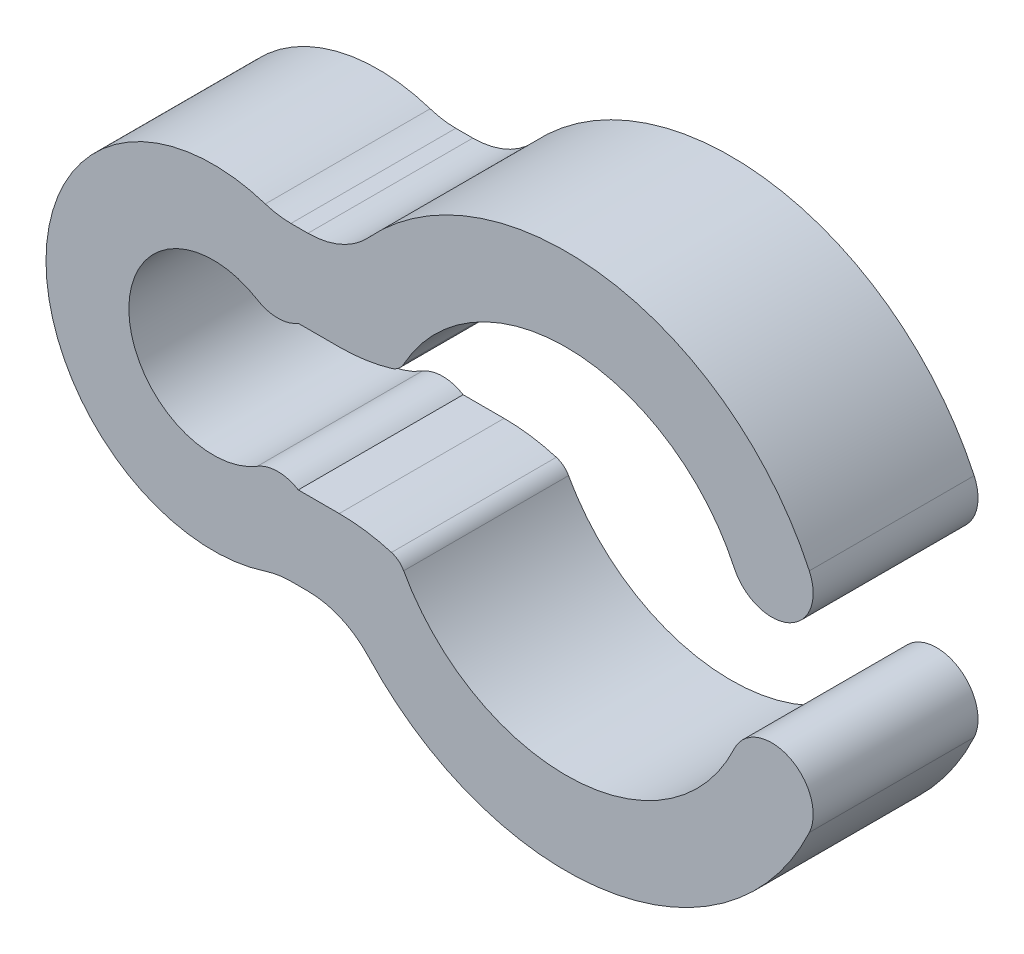
ISO-10303-21;
HEADER;
FILE_DESCRIPTION(('STEP AP214'),'2;1');
FILE_NAME('part.step','',(''),(''),'','','');
FILE_SCHEMA(('AUTOMOTIVE_DESIGN { 1 0 10303 214 1 1 1 1 }'));
ENDSEC;
DATA;
#1=APPLICATION_CONTEXT('core data for automotive mechanical design processes');
#2=APPLICATION_PROTOCOL_DEFINITION('international standard','automotive_design',2000,#1);
#3=PRODUCT_CONTEXT('',#1,'mechanical');
#4=PRODUCT('Part','Part','',(#3));
#5=PRODUCT_RELATED_PRODUCT_CATEGORY('part','',(#4));
#6=PRODUCT_DEFINITION_FORMATION('','',#4);
#7=PRODUCT_DEFINITION_CONTEXT('part definition',#1,'design');
#8=PRODUCT_DEFINITION('design','',#6,#7);
#9=PRODUCT_DEFINITION_SHAPE('','',#8);
#10=(LENGTH_UNIT() NAMED_UNIT(*) SI_UNIT(.MILLI.,.METRE.));
#11=(NAMED_UNIT(*) PLANE_ANGLE_UNIT() SI_UNIT($,.RADIAN.));
#12=(NAMED_UNIT(*) SI_UNIT($,.STERADIAN.) SOLID_ANGLE_UNIT());
#13=UNCERTAINTY_MEASURE_WITH_UNIT(LENGTH_MEASURE(1.E-05),#10,'distance_accuracy_value','');
#14=(GEOMETRIC_REPRESENTATION_CONTEXT(3) GLOBAL_UNCERTAINTY_ASSIGNED_CONTEXT((#13)) GLOBAL_UNIT_ASSIGNED_CONTEXT((#10,
#11,#12)) REPRESENTATION_CONTEXT('',''));
#15=CARTESIAN_POINT('',(0.,0.,0.));
#16=DIRECTION('',(0.,0.,1.));
#17=DIRECTION('',(1.,0.,0.));
#18=AXIS2_PLACEMENT_3D('',#15,#16,#17);
#19=CARTESIAN_POINT('',(-6.26438344931087,5.76,4.));
#20=DIRECTION('',(0.,0.,-1.));
#21=DIRECTION('',(-1.,0.,0.));
#22=AXIS2_PLACEMENT_3D('',#19,#20,#21);
#23=CYLINDRICAL_SURFACE('',#22,2.);
#24=CARTESIAN_POINT('',(-6.26438344931087,5.76,0.));
#25=DIRECTION('',(0.,0.,-1.));
#26=DIRECTION('',(1.,0.,0.));
#27=AXIS2_PLACEMENT_3D('',#24,#25,#26);
#28=CIRCLE('',#27,2.);
#29=CARTESIAN_POINT('',(-4.79214292068317,4.40629847238543,0.));
#30=VERTEX_POINT('',#29);
#31=CARTESIAN_POINT('',(-6.26438344931087,3.76,0.));
#32=VERTEX_POINT('',#31);
#33=EDGE_CURVE('E230',#30,#32,#28,.T.);
#34=ORIENTED_EDGE('',*,*,#33,.T.);
#35=DIRECTION('',(0.,0.,-1.));
#36=VECTOR('',#35,1.);
#37=CARTESIAN_POINT('',(-6.26438344931087,3.76,4.));
#38=LINE('',#37,#36);
#39=CARTESIAN_POINT('',(-6.26438344931087,3.76,4.));
#40=VERTEX_POINT('',#39);
#41=EDGE_CURVE('E11',#40,#32,#38,.T.);
#42=ORIENTED_EDGE('',*,*,#41,.F.);
#43=CARTESIAN_POINT('',(-6.26438344931087,5.76,4.));
#44=DIRECTION('',(0.,0.,-1.));
#45=DIRECTION('',(1.,0.,0.));
#46=AXIS2_PLACEMENT_3D('',#43,#44,#45);
#47=CIRCLE('',#46,2.);
#48=CARTESIAN_POINT('',(-4.79214292068317,4.40629847238543,4.));
#49=VERTEX_POINT('',#48);
#50=EDGE_CURVE('E294',#49,#40,#47,.T.);
#51=ORIENTED_EDGE('',*,*,#50,.F.);
#52=DIRECTION('',(0.,0.,-1.));
#53=VECTOR('',#52,1.);
#54=CARTESIAN_POINT('',(-4.79214292068317,4.40629847238543,4.));
#55=LINE('',#54,#53);
#56=EDGE_CURVE('E226',#49,#30,#55,.T.);
#57=ORIENTED_EDGE('',*,*,#56,.T.);
#58=EDGE_LOOP('',(#34,#42,#51,#57));
#59=FACE_BOUND('',#58,.T.);
#60=ADVANCED_FACE('F45',(#59),#23,.F.);
#61=CARTESIAN_POINT('',(-6.67691742082297,3.76,4.));
#62=DIRECTION('',(0.,-1.,0.));
#63=DIRECTION('',(0.,0.,-1.));
#64=AXIS2_PLACEMENT_3D('',#61,#62,#63);
#65=PLANE('',#64);
#66=DIRECTION('',(-1.,0.,0.));
#67=VECTOR('',#66,1.);
#68=CARTESIAN_POINT('',(-6.67691742082297,3.76,0.));
#69=LINE('',#68,#67);
#70=CARTESIAN_POINT('',(-6.67691742082297,3.76,0.));
#71=VERTEX_POINT('',#70);
#72=EDGE_CURVE('E234',#32,#71,#69,.T.);
#73=ORIENTED_EDGE('',*,*,#72,.T.);
#74=DIRECTION('',(0.,0.,-1.));
#75=VECTOR('',#74,1.);
#76=CARTESIAN_POINT('',(-6.67691742082297,3.76,4.));
#77=LINE('',#76,#75);
#78=CARTESIAN_POINT('',(-6.67691742082297,3.76,4.));
#79=VERTEX_POINT('',#78);
#80=EDGE_CURVE('E54',#79,#71,#77,.T.);
#81=ORIENTED_EDGE('',*,*,#80,.F.);
#82=DIRECTION('',(-1.,0.,0.));
#83=VECTOR('',#82,1.);
#84=CARTESIAN_POINT('',(-6.67691742082297,3.76,4.));
#85=LINE('',#84,#83);
#86=EDGE_CURVE('E147',#40,#79,#85,.T.);
#87=ORIENTED_EDGE('',*,*,#86,.F.);
#88=ORIENTED_EDGE('',*,*,#41,.T.);
#89=EDGE_LOOP('',(#73,#81,#87,#88));
#90=FACE_BOUND('',#89,.T.);
#91=ADVANCED_FACE('F458',(#90),#65,.F.);
#92=CARTESIAN_POINT('',(-6.67691742082297,5.76,4.));
#93=DIRECTION('',(0.,0.,-1.));
#94=DIRECTION('',(-1.,0.,0.));
#95=AXIS2_PLACEMENT_3D('',#92,#93,#94);
#96=CYLINDRICAL_SURFACE('',#95,2.);
#97=CARTESIAN_POINT('',(-6.67691742082297,5.76,0.));
#98=DIRECTION('',(0.,0.,-1.));
#99=DIRECTION('',(-1.,0.,0.));
#100=AXIS2_PLACEMENT_3D('',#97,#98,#99);
#101=CIRCLE('',#100,2.);
#102=CARTESIAN_POINT('',(-7.29839681989129,3.8590099009901,0.));
#103=VERTEX_POINT('',#102);
#104=EDGE_CURVE('E237',#71,#103,#101,.T.);
#105=ORIENTED_EDGE('',*,*,#104,.T.);
#106=DIRECTION('',(0.,0.,-1.));
#107=VECTOR('',#106,1.);
#108=CARTESIAN_POINT('',(-7.29839681989129,3.8590099009901,4.));
#109=LINE('',#108,#107);
#110=CARTESIAN_POINT('',(-7.29839681989129,3.8590099009901,4.));
#111=VERTEX_POINT('',#110);
#112=EDGE_CURVE('E361',#111,#103,#109,.T.);
#113=ORIENTED_EDGE('',*,*,#112,.F.);
#114=CARTESIAN_POINT('',(-6.67691742082297,5.76,4.));
#115=DIRECTION('',(0.,0.,-1.));
#116=DIRECTION('',(-1.,0.,0.));
#117=AXIS2_PLACEMENT_3D('',#114,#115,#116);
#118=CIRCLE('',#117,2.);
#119=EDGE_CURVE('E371',#79,#111,#118,.T.);
#120=ORIENTED_EDGE('',*,*,#119,.F.);
#121=ORIENTED_EDGE('',*,*,#80,.T.);
#122=EDGE_LOOP('',(#105,#113,#120,#121));
#123=FACE_BOUND('',#122,.T.);
#124=ADVANCED_FACE('F369',(#123),#96,.F.);
#125=CARTESIAN_POINT('',(-8.56,0.,4.));
#126=DIRECTION('',(0.,0.,-1.));
#127=DIRECTION('',(-1.,0.,0.));
#128=AXIS2_PLACEMENT_3D('',#125,#126,#127);
#129=CYLINDRICAL_SURFACE('',#128,4.06);
#130=CARTESIAN_POINT('',(-8.56,0.,0.));
#131=DIRECTION('',(0.,0.,1.));
#132=DIRECTION('',(1.,0.,0.));
#133=AXIS2_PLACEMENT_3D('',#130,#131,#132);
#134=CIRCLE('',#133,4.06);
#135=CARTESIAN_POINT('',(-7.2983968198913,-3.8590099009901,0.));
#136=VERTEX_POINT('',#135);
#137=EDGE_CURVE('E240',#103,#136,#134,.T.);
#138=ORIENTED_EDGE('',*,*,#137,.T.);
#139=DIRECTION('',(0.,0.,-1.));
#140=VECTOR('',#139,1.);
#141=CARTESIAN_POINT('',(-7.2983968198913,-3.8590099009901,4.));
#142=LINE('',#141,#140);
#143=CARTESIAN_POINT('',(-7.2983968198913,-3.8590099009901,4.));
#144=VERTEX_POINT('',#143);
#145=EDGE_CURVE('E357',#144,#136,#142,.T.);
#146=ORIENTED_EDGE('',*,*,#145,.F.);
#147=CARTESIAN_POINT('',(-8.56,0.,4.));
#148=DIRECTION('',(0.,0.,1.));
#149=DIRECTION('',(1.,0.,0.));
#150=AXIS2_PLACEMENT_3D('',#147,#148,#149);
#151=CIRCLE('',#150,4.06);
#152=EDGE_CURVE('E390',#111,#144,#151,.T.);
#153=ORIENTED_EDGE('',*,*,#152,.F.);
#154=ORIENTED_EDGE('',*,*,#112,.T.);
#155=EDGE_LOOP('',(#138,#146,#153,#154));
#156=FACE_BOUND('',#155,.T.);
#157=ADVANCED_FACE('F380',(#156),#129,.T.);
#158=CARTESIAN_POINT('',(-6.67691742082297,-5.76,4.));
#159=DIRECTION('',(0.,0.,-1.));
#160=DIRECTION('',(-1.,0.,0.));
#161=AXIS2_PLACEMENT_3D('',#158,#159,#160);
#162=CYLINDRICAL_SURFACE('',#161,2.);
#163=CARTESIAN_POINT('',(-6.67691742082297,-5.76,0.));
#164=DIRECTION('',(0.,0.,-1.));
#165=DIRECTION('',(1.,0.,0.));
#166=AXIS2_PLACEMENT_3D('',#163,#164,#165);
#167=CIRCLE('',#166,2.);
#168=CARTESIAN_POINT('',(-6.67691742082297,-3.76,0.));
#169=VERTEX_POINT('',#168);
#170=EDGE_CURVE('E243',#136,#169,#167,.T.);
#171=ORIENTED_EDGE('',*,*,#170,.T.);
#172=DIRECTION('',(0.,0.,-1.));
#173=VECTOR('',#172,1.);
#174=CARTESIAN_POINT('',(-6.67691742082297,-3.76,4.));
#175=LINE('',#174,#173);
#176=CARTESIAN_POINT('',(-6.67691742082297,-3.76,4.));
#177=VERTEX_POINT('',#176);
#178=EDGE_CURVE('E353',#177,#169,#175,.T.);
#179=ORIENTED_EDGE('',*,*,#178,.F.);
#180=CARTESIAN_POINT('',(-6.67691742082297,-5.76,4.));
#181=DIRECTION('',(0.,0.,-1.));
#182=DIRECTION('',(1.,0.,0.));
#183=AXIS2_PLACEMENT_3D('',#180,#181,#182);
#184=CIRCLE('',#183,2.);
#185=EDGE_CURVE('E386',#144,#177,#184,.T.);
#186=ORIENTED_EDGE('',*,*,#185,.F.);
#187=ORIENTED_EDGE('',*,*,#145,.T.);
#188=EDGE_LOOP('',(#171,#179,#186,#187));
#189=FACE_BOUND('',#188,.T.);
#190=ADVANCED_FACE('F384',(#189),#162,.F.);
#191=CARTESIAN_POINT('',(-6.67691742082297,-3.76,4.));
#192=DIRECTION('',(0.,1.,0.));
#193=DIRECTION('',(-1.,0.,0.));
#194=AXIS2_PLACEMENT_3D('',#191,#192,#193);
#195=PLANE('',#194);
#196=DIRECTION('',(1.,0.,0.));
#197=VECTOR('',#196,1.);
#198=CARTESIAN_POINT('',(-6.67691742082297,-3.76,0.));
#199=LINE('',#198,#197);
#200=CARTESIAN_POINT('',(-6.26438344931088,-3.76,0.));
#201=VERTEX_POINT('',#200);
#202=EDGE_CURVE('E246',#169,#201,#199,.T.);
#203=ORIENTED_EDGE('',*,*,#202,.T.);
#204=DIRECTION('',(0.,0.,-1.));
#205=VECTOR('',#204,1.);
#206=CARTESIAN_POINT('',(-6.26438344931088,-3.76,4.));
#207=LINE('',#206,#205);
#208=CARTESIAN_POINT('',(-6.26438344931088,-3.76,4.));
#209=VERTEX_POINT('',#208);
#210=EDGE_CURVE('E349',#209,#201,#207,.T.);
#211=ORIENTED_EDGE('',*,*,#210,.F.);
#212=DIRECTION('',(1.,0.,0.));
#213=VECTOR('',#212,1.);
#214=CARTESIAN_POINT('',(-6.67691742082297,-3.76,4.));
#215=LINE('',#214,#213);
#216=EDGE_CURVE('E389',#177,#209,#215,.T.);
#217=ORIENTED_EDGE('',*,*,#216,.F.);
#218=ORIENTED_EDGE('',*,*,#178,.T.);
#219=EDGE_LOOP('',(#203,#211,#217,#218));
#220=FACE_BOUND('',#219,.T.);
#221=ADVANCED_FACE('F471',(#220),#195,.F.);
#222=CARTESIAN_POINT('',(-6.26438344931088,-5.76,4.));
#223=DIRECTION('',(0.,0.,-1.));
#224=DIRECTION('',(-1.,0.,0.));
#225=AXIS2_PLACEMENT_3D('',#222,#223,#224);
#226=CYLINDRICAL_SURFACE('',#225,2.);
#227=CARTESIAN_POINT('',(-6.26438344931088,-5.76,0.));
#228=DIRECTION('',(0.,0.,-1.));
#229=DIRECTION('',(-1.,0.,0.));
#230=AXIS2_PLACEMENT_3D('',#227,#228,#229);
#231=CIRCLE('',#230,2.);
#232=CARTESIAN_POINT('',(-4.79214292068318,-4.40629847238543,0.));
#233=VERTEX_POINT('',#232);
#234=EDGE_CURVE('E249',#201,#233,#231,.T.);
#235=ORIENTED_EDGE('',*,*,#234,.T.);
#236=DIRECTION('',(0.,0.,-1.));
#237=VECTOR('',#236,1.);
#238=CARTESIAN_POINT('',(-4.79214292068318,-4.40629847238543,4.));
#239=LINE('',#238,#237);
#240=CARTESIAN_POINT('',(-4.79214292068318,-4.40629847238543,4.));
#241=VERTEX_POINT('',#240);
#242=EDGE_CURVE('E345',#241,#233,#239,.T.);
#243=ORIENTED_EDGE('',*,*,#242,.F.);
#244=CARTESIAN_POINT('',(-6.26438344931088,-5.76,4.));
#245=DIRECTION('',(0.,0.,-1.));
#246=DIRECTION('',(-1.,0.,0.));
#247=AXIS2_PLACEMENT_3D('',#244,#245,#246);
#248=CIRCLE('',#247,2.);
#249=EDGE_CURVE('E394',#209,#241,#248,.T.);
#250=ORIENTED_EDGE('',*,*,#249,.F.);
#251=ORIENTED_EDGE('',*,*,#210,.T.);
#252=EDGE_LOOP('',(#235,#243,#250,#251));
#253=FACE_BOUND('',#252,.T.);
#254=ADVANCED_FACE('F474',(#253),#226,.F.);
#255=CARTESIAN_POINT('',(0.,0.,4.));
#256=DIRECTION('',(0.,0.,-1.));
#257=DIRECTION('',(-1.,0.,0.));
#258=AXIS2_PLACEMENT_3D('',#255,#256,#257);
#259=CYLINDRICAL_SURFACE('',#258,6.51);
#260=CARTESIAN_POINT('',(0.,0.,0.));
#261=DIRECTION('',(0.,0.,1.));
#262=DIRECTION('',(1.,0.,0.));
#263=AXIS2_PLACEMENT_3D('',#260,#261,#262);
#264=CIRCLE('',#263,6.51);
#265=CARTESIAN_POINT('',(5.90126525039805,-2.74866666666667,0.));
#266=VERTEX_POINT('',#265);
#267=EDGE_CURVE('E252',#233,#266,#264,.T.);
#268=ORIENTED_EDGE('',*,*,#267,.T.);
#269=DIRECTION('',(0.,0.,-1.));
#270=VECTOR('',#269,1.);
#271=CARTESIAN_POINT('',(5.90126525039805,-2.74866666666667,4.));
#272=LINE('',#271,#270);
#273=CARTESIAN_POINT('',(5.90126525039805,-2.74866666666667,4.));
#274=VERTEX_POINT('',#273);
#275=EDGE_CURVE('E341',#274,#266,#272,.T.);
#276=ORIENTED_EDGE('',*,*,#275,.F.);
#277=CARTESIAN_POINT('',(0.,0.,4.));
#278=DIRECTION('',(0.,0.,1.));
#279=DIRECTION('',(1.,0.,0.));
#280=AXIS2_PLACEMENT_3D('',#277,#278,#279);
#281=CIRCLE('',#280,6.51);
#282=EDGE_CURVE('E401',#241,#274,#281,.T.);
#283=ORIENTED_EDGE('',*,*,#282,.F.);
#284=ORIENTED_EDGE('',*,*,#242,.T.);
#285=EDGE_LOOP('',(#268,#276,#283,#284));
#286=FACE_BOUND('',#285,.T.);
#287=ADVANCED_FACE('F478',(#286),#259,.T.);
#288=CARTESIAN_POINT('',(4.99024043063614,-2.32433333333333,4.));
#289=DIRECTION('',(0.,0.,-1.));
#290=DIRECTION('',(-1.,0.,0.));
#291=AXIS2_PLACEMENT_3D('',#288,#289,#290);
#292=CYLINDRICAL_SURFACE('',#291,1.005);
#293=CARTESIAN_POINT('',(4.99024043063614,-2.32433333333333,0.));
#294=DIRECTION('',(0.,0.,1.));
#295=DIRECTION('',(1.,0.,0.));
#296=AXIS2_PLACEMENT_3D('',#293,#294,#295);
#297=CIRCLE('',#296,1.005);
#298=CARTESIAN_POINT('',(4.07921561087423,-1.9,0.));
#299=VERTEX_POINT('',#298);
#300=EDGE_CURVE('E255',#266,#299,#297,.T.);
#301=ORIENTED_EDGE('',*,*,#300,.T.);
#302=DIRECTION('',(0.,0.,-1.));
#303=VECTOR('',#302,1.);
#304=CARTESIAN_POINT('',(4.07921561087423,-1.9,4.));
#305=LINE('',#304,#303);
#306=CARTESIAN_POINT('',(4.07921561087423,-1.9,4.));
#307=VERTEX_POINT('',#306);
#308=EDGE_CURVE('E337',#307,#299,#305,.T.);
#309=ORIENTED_EDGE('',*,*,#308,.F.);
#310=CARTESIAN_POINT('',(4.99024043063614,-2.32433333333333,4.));
#311=DIRECTION('',(0.,0.,1.));
#312=DIRECTION('',(1.,0.,0.));
#313=AXIS2_PLACEMENT_3D('',#310,#311,#312);
#314=CIRCLE('',#313,1.005);
#315=EDGE_CURVE('E404',#274,#307,#314,.T.);
#316=ORIENTED_EDGE('',*,*,#315,.F.);
#317=ORIENTED_EDGE('',*,*,#275,.T.);
#318=EDGE_LOOP('',(#301,#309,#316,#317));
#319=FACE_BOUND('',#318,.T.);
#320=ADVANCED_FACE('F482',(#319),#292,.T.);
#321=CARTESIAN_POINT('',(0.,0.,4.));
#322=DIRECTION('',(0.,0.,-1.));
#323=DIRECTION('',(-1.,0.,0.));
#324=AXIS2_PLACEMENT_3D('',#321,#322,#323);
#325=CYLINDRICAL_SURFACE('',#324,4.5);
#326=CARTESIAN_POINT('',(0.,0.,0.));
#327=DIRECTION('',(0.,0.,-1.));
#328=DIRECTION('',(1.,0.,0.));
#329=AXIS2_PLACEMENT_3D('',#326,#327,#328);
#330=CIRCLE('',#329,4.5);
#331=CARTESIAN_POINT('',(-3.94129190088489,-2.17168555551193,0.));
#332=VERTEX_POINT('',#331);
#333=EDGE_CURVE('E258',#299,#332,#330,.T.);
#334=ORIENTED_EDGE('',*,*,#333,.T.);
#335=DIRECTION('',(0.,0.,-1.));
#336=VECTOR('',#335,1.);
#337=CARTESIAN_POINT('',(-3.94129190088489,-2.17168555551193,4.));
#338=LINE('',#337,#336);
#339=CARTESIAN_POINT('',(-3.94129190088489,-2.17168555551193,4.));
#340=VERTEX_POINT('',#339);
#341=EDGE_CURVE('E333',#340,#332,#338,.T.);
#342=ORIENTED_EDGE('',*,*,#341,.F.);
#343=CARTESIAN_POINT('',(0.,0.,4.));
#344=DIRECTION('',(0.,0.,-1.));
#345=DIRECTION('',(1.,0.,0.));
#346=AXIS2_PLACEMENT_3D('',#343,#344,#345);
#347=CIRCLE('',#346,4.5);
#348=EDGE_CURVE('E407',#307,#340,#347,.T.);
#349=ORIENTED_EDGE('',*,*,#348,.F.);
#350=ORIENTED_EDGE('',*,*,#308,.T.);
#351=EDGE_LOOP('',(#334,#342,#349,#350));
#352=FACE_BOUND('',#351,.T.);
#353=ADVANCED_FACE('F486',(#352),#325,.F.);
#354=CARTESIAN_POINT('',(-4.37921322320543,-2.41298395056881,4.));
#355=DIRECTION('',(0.,0.,-1.));
#356=DIRECTION('',(-1.,0.,0.));
#357=AXIS2_PLACEMENT_3D('',#354,#355,#356);
#358=CYLINDRICAL_SURFACE('',#357,0.5);
#359=CARTESIAN_POINT('',(-4.37921322320543,-2.41298395056881,0.));
#360=DIRECTION('',(0.,0.,1.));
#361=DIRECTION('',(1.,0.,0.));
#362=AXIS2_PLACEMENT_3D('',#359,#360,#361);
#363=CIRCLE('',#362,0.5);
#364=CARTESIAN_POINT('',(-4.23741190929705,-1.93351300528239,0.));
#365=VERTEX_POINT('',#364);
#366=EDGE_CURVE('E261',#332,#365,#363,.T.);
#367=ORIENTED_EDGE('',*,*,#366,.T.);
#368=DIRECTION('',(0.,0.,-1.));
#369=VECTOR('',#368,1.);
#370=CARTESIAN_POINT('',(-4.23741190929705,-1.93351300528239,4.));
#371=LINE('',#370,#369);
#372=CARTESIAN_POINT('',(-4.23741190929705,-1.93351300528239,4.));
#373=VERTEX_POINT('',#372);
#374=EDGE_CURVE('E329',#373,#365,#371,.T.);
#375=ORIENTED_EDGE('',*,*,#374,.F.);
#376=CARTESIAN_POINT('',(-4.37921322320543,-2.41298395056881,4.));
#377=DIRECTION('',(0.,0.,1.));
#378=DIRECTION('',(1.,0.,0.));
#379=AXIS2_PLACEMENT_3D('',#376,#377,#378);
#380=CIRCLE('',#379,0.5);
#381=EDGE_CURVE('E410',#340,#373,#380,.T.);
#382=ORIENTED_EDGE('',*,*,#381,.F.);
#383=ORIENTED_EDGE('',*,*,#341,.T.);
#384=EDGE_LOOP('',(#367,#375,#382,#383));
#385=FACE_BOUND('',#384,.T.);
#386=ADVANCED_FACE('F490',(#385),#358,.T.);
#387=CARTESIAN_POINT('',(-5.505,-6.21959219123293,4.));
#388=DIRECTION('',(0.,0.,-1.));
#389=DIRECTION('',(-1.,0.,0.));
#390=AXIS2_PLACEMENT_3D('',#387,#388,#389);
#391=CYLINDRICAL_SURFACE('',#390,4.46959219123293);
#392=CARTESIAN_POINT('',(-5.505,-6.21959219123293,0.));
#393=DIRECTION('',(0.,0.,1.));
#394=DIRECTION('',(-1.,0.,0.));
#395=AXIS2_PLACEMENT_3D('',#392,#393,#394);
#396=CIRCLE('',#395,4.46959219123293);
#397=CARTESIAN_POINT('',(-5.505,-1.75,0.));
#398=VERTEX_POINT('',#397);
#399=EDGE_CURVE('E264',#365,#398,#396,.T.);
#400=ORIENTED_EDGE('',*,*,#399,.T.);
#401=DIRECTION('',(0.,0.,-1.));
#402=VECTOR('',#401,1.);
#403=CARTESIAN_POINT('',(-5.505,-1.75,4.));
#404=LINE('',#403,#402);
#405=CARTESIAN_POINT('',(-5.505,-1.75,4.));
#406=VERTEX_POINT('',#405);
#407=EDGE_CURVE('E325',#406,#398,#404,.T.);
#408=ORIENTED_EDGE('',*,*,#407,.F.);
#409=CARTESIAN_POINT('',(-5.505,-6.21959219123293,4.));
#410=DIRECTION('',(0.,0.,1.));
#411=DIRECTION('',(-1.,0.,0.));
#412=AXIS2_PLACEMENT_3D('',#409,#410,#411);
#413=CIRCLE('',#412,4.46959219123293);
#414=EDGE_CURVE('E413',#373,#406,#413,.T.);
#415=ORIENTED_EDGE('',*,*,#414,.F.);
#416=ORIENTED_EDGE('',*,*,#374,.T.);
#417=EDGE_LOOP('',(#400,#408,#415,#416));
#418=FACE_BOUND('',#417,.T.);
#419=ADVANCED_FACE('F494',(#418),#391,.T.);
#420=CARTESIAN_POINT('',(-6.49864608739844,-1.75,4.));
#421=DIRECTION('',(0.,-1.,0.));
#422=DIRECTION('',(0.,0.,-1.));
#423=AXIS2_PLACEMENT_3D('',#420,#421,#422);
#424=PLANE('',#423);
#425=DIRECTION('',(-1.,0.,0.));
#426=VECTOR('',#425,1.);
#427=CARTESIAN_POINT('',(-6.49864608739844,-1.75,0.));
#428=LINE('',#427,#426);
#429=CARTESIAN_POINT('',(-6.49864608739844,-1.75,0.));
#430=VERTEX_POINT('',#429);
#431=EDGE_CURVE('E267',#398,#430,#428,.T.);
#432=ORIENTED_EDGE('',*,*,#431,.T.);
#433=DIRECTION('',(0.,0.,-1.));
#434=VECTOR('',#433,1.);
#435=CARTESIAN_POINT('',(-6.49864608739844,-1.75,4.));
#436=LINE('',#435,#434);
#437=CARTESIAN_POINT('',(-6.49864608739844,-1.75,4.));
#438=VERTEX_POINT('',#437);
#439=EDGE_CURVE('E321',#438,#430,#436,.T.);
#440=ORIENTED_EDGE('',*,*,#439,.F.);
#441=DIRECTION('',(-1.,0.,0.));
#442=VECTOR('',#441,1.);
#443=CARTESIAN_POINT('',(-6.49864608739844,-1.75,4.));
#444=LINE('',#443,#442);
#445=EDGE_CURVE('E416',#406,#438,#444,.T.);
#446=ORIENTED_EDGE('',*,*,#445,.F.);
#447=ORIENTED_EDGE('',*,*,#407,.T.);
#448=EDGE_LOOP('',(#432,#440,#446,#447));
#449=FACE_BOUND('',#448,.T.);
#450=ADVANCED_FACE('F498',(#449),#424,.F.);
#451=CARTESIAN_POINT('',(-6.99546913109765,-2.56430547379215,4.));
#452=DIRECTION('',(0.,0.,-1.));
#453=DIRECTION('',(-1.,0.,0.));
#454=AXIS2_PLACEMENT_3D('',#451,#452,#453);
#455=CYLINDRICAL_SURFACE('',#454,0.953900697870813);
#456=CARTESIAN_POINT('',(-6.99546913109765,-2.56430547379215,0.));
#457=DIRECTION('',(0.,0.,1.));
#458=DIRECTION('',(-1.,0.,0.));
#459=AXIS2_PLACEMENT_3D('',#456,#457,#458);
#460=CIRCLE('',#459,0.953900697870813);
#461=CARTESIAN_POINT('',(-7.49229217479687,-1.75,0.));
#462=VERTEX_POINT('',#461);
#463=EDGE_CURVE('E270',#430,#462,#460,.T.);
#464=ORIENTED_EDGE('',*,*,#463,.T.);
#465=DIRECTION('',(0.,0.,-1.));
#466=VECTOR('',#465,1.);
#467=CARTESIAN_POINT('',(-7.49229217479687,-1.75,4.));
#468=LINE('',#467,#466);
#469=CARTESIAN_POINT('',(-7.49229217479687,-1.75,4.));
#470=VERTEX_POINT('',#469);
#471=EDGE_CURVE('E317',#470,#462,#468,.T.);
#472=ORIENTED_EDGE('',*,*,#471,.F.);
#473=CARTESIAN_POINT('',(-6.99546913109765,-2.56430547379215,4.));
#474=DIRECTION('',(0.,0.,1.));
#475=DIRECTION('',(-1.,0.,0.));
#476=AXIS2_PLACEMENT_3D('',#473,#474,#475);
#477=CIRCLE('',#476,0.953900697870813);
#478=EDGE_CURVE('E419',#438,#470,#477,.T.);
#479=ORIENTED_EDGE('',*,*,#478,.F.);
#480=ORIENTED_EDGE('',*,*,#439,.T.);
#481=EDGE_LOOP('',(#464,#472,#479,#480));
#482=FACE_BOUND('',#481,.T.);
#483=ADVANCED_FACE('F502',(#482),#455,.T.);
#484=CARTESIAN_POINT('',(-8.56,0.,4.));
#485=DIRECTION('',(0.,0.,-1.));
#486=DIRECTION('',(-1.,0.,0.));
#487=AXIS2_PLACEMENT_3D('',#484,#485,#486);
#488=CYLINDRICAL_SURFACE('',#487,2.05);
#489=CARTESIAN_POINT('',(-8.56,0.,0.));
#490=DIRECTION('',(0.,0.,-1.));
#491=DIRECTION('',(1.,0.,0.));
#492=AXIS2_PLACEMENT_3D('',#489,#490,#491);
#493=CIRCLE('',#492,2.05);
#494=CARTESIAN_POINT('',(-7.49229217479687,1.75,0.));
#495=VERTEX_POINT('',#494);
#496=EDGE_CURVE('E273',#462,#495,#493,.T.);
#497=ORIENTED_EDGE('',*,*,#496,.T.);
#498=DIRECTION('',(0.,0.,-1.));
#499=VECTOR('',#498,1.);
#500=CARTESIAN_POINT('',(-7.49229217479687,1.75,4.));
#501=LINE('',#500,#499);
#502=CARTESIAN_POINT('',(-7.49229217479687,1.75,4.));
#503=VERTEX_POINT('',#502);
#504=EDGE_CURVE('E313',#503,#495,#501,.T.);
#505=ORIENTED_EDGE('',*,*,#504,.F.);
#506=CARTESIAN_POINT('',(-8.56,0.,4.));
#507=DIRECTION('',(0.,0.,-1.));
#508=DIRECTION('',(1.,0.,0.));
#509=AXIS2_PLACEMENT_3D('',#506,#507,#508);
#510=CIRCLE('',#509,2.05);
#511=EDGE_CURVE('E422',#470,#503,#510,.T.);
#512=ORIENTED_EDGE('',*,*,#511,.F.);
#513=ORIENTED_EDGE('',*,*,#471,.T.);
#514=EDGE_LOOP('',(#497,#505,#512,#513));
#515=FACE_BOUND('',#514,.T.);
#516=ADVANCED_FACE('F506',(#515),#488,.F.);
#517=CARTESIAN_POINT('',(-6.99546913109765,2.56430547379216,4.));
#518=DIRECTION('',(0.,0.,-1.));
#519=DIRECTION('',(-1.,0.,0.));
#520=AXIS2_PLACEMENT_3D('',#517,#518,#519);
#521=CYLINDRICAL_SURFACE('',#520,0.953900697870811);
#522=CARTESIAN_POINT('',(-6.99546913109765,2.56430547379216,0.));
#523=DIRECTION('',(0.,0.,1.));
#524=DIRECTION('',(1.,0.,0.));
#525=AXIS2_PLACEMENT_3D('',#522,#523,#524);
#526=CIRCLE('',#525,0.953900697870811);
#527=CARTESIAN_POINT('',(-6.49864608739844,1.75,0.));
#528=VERTEX_POINT('',#527);
#529=EDGE_CURVE('E276',#495,#528,#526,.T.);
#530=ORIENTED_EDGE('',*,*,#529,.T.);
#531=DIRECTION('',(0.,0.,-1.));
#532=VECTOR('',#531,1.);
#533=CARTESIAN_POINT('',(-6.49864608739844,1.75,4.));
#534=LINE('',#533,#532);
#535=CARTESIAN_POINT('',(-6.49864608739844,1.75,4.));
#536=VERTEX_POINT('',#535);
#537=EDGE_CURVE('E309',#536,#528,#534,.T.);
#538=ORIENTED_EDGE('',*,*,#537,.F.);
#539=CARTESIAN_POINT('',(-6.99546913109765,2.56430547379216,4.));
#540=DIRECTION('',(0.,0.,1.));
#541=DIRECTION('',(1.,0.,0.));
#542=AXIS2_PLACEMENT_3D('',#539,#540,#541);
#543=CIRCLE('',#542,0.953900697870811);
#544=EDGE_CURVE('E425',#503,#536,#543,.T.);
#545=ORIENTED_EDGE('',*,*,#544,.F.);
#546=ORIENTED_EDGE('',*,*,#504,.T.);
#547=EDGE_LOOP('',(#530,#538,#545,#546));
#548=FACE_BOUND('',#547,.T.);
#549=ADVANCED_FACE('F510',(#548),#521,.T.);
#550=CARTESIAN_POINT('',(-6.49864608739844,1.75,4.));
#551=DIRECTION('',(0.,1.,0.));
#552=DIRECTION('',(0.,0.,1.));
#553=AXIS2_PLACEMENT_3D('',#550,#551,#552);
#554=PLANE('',#553);
#555=DIRECTION('',(1.,0.,0.));
#556=VECTOR('',#555,1.);
#557=CARTESIAN_POINT('',(-6.49864608739844,1.75,0.));
#558=LINE('',#557,#556);
#559=CARTESIAN_POINT('',(-5.505,1.75,0.));
#560=VERTEX_POINT('',#559);
#561=EDGE_CURVE('E279',#528,#560,#558,.T.);
#562=ORIENTED_EDGE('',*,*,#561,.T.);
#563=DIRECTION('',(0.,0.,-1.));
#564=VECTOR('',#563,1.);
#565=CARTESIAN_POINT('',(-5.505,1.75,4.));
#566=LINE('',#565,#564);
#567=CARTESIAN_POINT('',(-5.505,1.75,4.));
#568=VERTEX_POINT('',#567);
#569=EDGE_CURVE('E305',#568,#560,#566,.T.);
#570=ORIENTED_EDGE('',*,*,#569,.F.);
#571=DIRECTION('',(1.,0.,0.));
#572=VECTOR('',#571,1.);
#573=CARTESIAN_POINT('',(-6.49864608739844,1.75,4.));
#574=LINE('',#573,#572);
#575=EDGE_CURVE('E428',#536,#568,#574,.T.);
#576=ORIENTED_EDGE('',*,*,#575,.F.);
#577=ORIENTED_EDGE('',*,*,#537,.T.);
#578=EDGE_LOOP('',(#562,#570,#576,#577));
#579=FACE_BOUND('',#578,.T.);
#580=ADVANCED_FACE('F514',(#579),#554,.F.);
#581=CARTESIAN_POINT('',(-5.505,6.219592191233,4.));
#582=DIRECTION('',(0.,0.,-1.));
#583=DIRECTION('',(-1.,0.,0.));
#584=AXIS2_PLACEMENT_3D('',#581,#582,#583);
#585=CYLINDRICAL_SURFACE('',#584,4.469592191233);
#586=CARTESIAN_POINT('',(-5.505,6.219592191233,0.));
#587=DIRECTION('',(0.,0.,1.));
#588=DIRECTION('',(1.,0.,0.));
#589=AXIS2_PLACEMENT_3D('',#586,#587,#588);
#590=CIRCLE('',#589,4.469592191233);
#591=CARTESIAN_POINT('',(-4.23741190929706,1.93351300528239,0.));
#592=VERTEX_POINT('',#591);
#593=EDGE_CURVE('E282',#560,#592,#590,.T.);
#594=ORIENTED_EDGE('',*,*,#593,.T.);
#595=DIRECTION('',(0.,0.,-1.));
#596=VECTOR('',#595,1.);
#597=CARTESIAN_POINT('',(-4.23741190929706,1.93351300528239,4.));
#598=LINE('',#597,#596);
#599=CARTESIAN_POINT('',(-4.23741190929706,1.93351300528239,4.));
#600=VERTEX_POINT('',#599);
#601=EDGE_CURVE('E301',#600,#592,#598,.T.);
#602=ORIENTED_EDGE('',*,*,#601,.F.);
#603=CARTESIAN_POINT('',(-5.505,6.219592191233,4.));
#604=DIRECTION('',(0.,0.,1.));
#605=DIRECTION('',(1.,0.,0.));
#606=AXIS2_PLACEMENT_3D('',#603,#604,#605);
#607=CIRCLE('',#606,4.469592191233);
#608=EDGE_CURVE('E431',#568,#600,#607,.T.);
#609=ORIENTED_EDGE('',*,*,#608,.F.);
#610=ORIENTED_EDGE('',*,*,#569,.T.);
#611=EDGE_LOOP('',(#594,#602,#609,#610));
#612=FACE_BOUND('',#611,.T.);
#613=ADVANCED_FACE('F439',(#612),#585,.T.);
#614=CARTESIAN_POINT('',(-4.37921322320543,2.41298395056882,4.));
#615=DIRECTION('',(0.,0.,-1.));
#616=DIRECTION('',(-1.,0.,0.));
#617=AXIS2_PLACEMENT_3D('',#614,#615,#616);
#618=CYLINDRICAL_SURFACE('',#617,0.5);
#619=CARTESIAN_POINT('',(-4.37921322320543,2.41298395056882,0.));
#620=DIRECTION('',(0.,0.,1.));
#621=DIRECTION('',(-1.,0.,0.));
#622=AXIS2_PLACEMENT_3D('',#619,#620,#621);
#623=CIRCLE('',#622,0.5);
#624=CARTESIAN_POINT('',(-3.94129190088489,2.17168555551193,0.));
#625=VERTEX_POINT('',#624);
#626=EDGE_CURVE('E285',#592,#625,#623,.T.);
#627=ORIENTED_EDGE('',*,*,#626,.T.);
#628=DIRECTION('',(0.,0.,-1.));
#629=VECTOR('',#628,1.);
#630=CARTESIAN_POINT('',(-3.94129190088489,2.17168555551193,4.));
#631=LINE('',#630,#629);
#632=CARTESIAN_POINT('',(-3.94129190088489,2.17168555551193,4.));
#633=VERTEX_POINT('',#632);
#634=EDGE_CURVE('E219',#633,#625,#631,.T.);
#635=ORIENTED_EDGE('',*,*,#634,.F.);
#636=CARTESIAN_POINT('',(-4.37921322320543,2.41298395056882,4.));
#637=DIRECTION('',(0.,0.,1.));
#638=DIRECTION('',(-1.,0.,0.));
#639=AXIS2_PLACEMENT_3D('',#636,#637,#638);
#640=CIRCLE('',#639,0.5);
#641=EDGE_CURVE('E208',#600,#633,#640,.T.);
#642=ORIENTED_EDGE('',*,*,#641,.F.);
#643=ORIENTED_EDGE('',*,*,#601,.T.);
#644=EDGE_LOOP('',(#627,#635,#642,#643));
#645=FACE_BOUND('',#644,.T.);
#646=ADVANCED_FACE('F443',(#645),#618,.T.);
#647=CARTESIAN_POINT('',(0.,0.,4.));
#648=DIRECTION('',(0.,0.,-1.));
#649=DIRECTION('',(-1.,0.,0.));
#650=AXIS2_PLACEMENT_3D('',#647,#648,#649);
#651=CYLINDRICAL_SURFACE('',#650,4.5);
#652=CARTESIAN_POINT('',(0.,0.,0.));
#653=DIRECTION('',(0.,0.,-1.));
#654=DIRECTION('',(1.,0.,0.));
#655=AXIS2_PLACEMENT_3D('',#652,#653,#654);
#656=CIRCLE('',#655,4.5);
#657=CARTESIAN_POINT('',(4.07921561087423,1.9,0.));
#658=VERTEX_POINT('',#657);
#659=EDGE_CURVE('E217',#625,#658,#656,.T.);
#660=ORIENTED_EDGE('',*,*,#659,.T.);
#661=DIRECTION('',(0.,0.,-1.));
#662=VECTOR('',#661,1.);
#663=CARTESIAN_POINT('',(4.07921561087423,1.9,4.));
#664=LINE('',#663,#662);
#665=CARTESIAN_POINT('',(4.07921561087423,1.9,4.));
#666=VERTEX_POINT('',#665);
#667=EDGE_CURVE('E214',#666,#658,#664,.T.);
#668=ORIENTED_EDGE('',*,*,#667,.F.);
#669=CARTESIAN_POINT('',(0.,0.,4.));
#670=DIRECTION('',(0.,0.,-1.));
#671=DIRECTION('',(1.,0.,0.));
#672=AXIS2_PLACEMENT_3D('',#669,#670,#671);
#673=CIRCLE('',#672,4.5);
#674=EDGE_CURVE('E202',#633,#666,#673,.T.);
#675=ORIENTED_EDGE('',*,*,#674,.F.);
#676=ORIENTED_EDGE('',*,*,#634,.T.);
#677=EDGE_LOOP('',(#660,#668,#675,#676));
#678=FACE_BOUND('',#677,.T.);
#679=ADVANCED_FACE('F215',(#678),#651,.F.);
#680=CARTESIAN_POINT('',(4.99024043063614,2.32433333333333,4.));
#681=DIRECTION('',(0.,0.,-1.));
#682=DIRECTION('',(-1.,0.,0.));
#683=AXIS2_PLACEMENT_3D('',#680,#681,#682);
#684=CYLINDRICAL_SURFACE('',#683,1.005);
#685=CARTESIAN_POINT('',(4.99024043063614,2.32433333333333,0.));
#686=DIRECTION('',(0.,0.,1.));
#687=DIRECTION('',(1.,0.,0.));
#688=AXIS2_PLACEMENT_3D('',#685,#686,#687);
#689=CIRCLE('',#688,1.005);
#690=CARTESIAN_POINT('',(5.90126525039805,2.74866666666667,0.));
#691=VERTEX_POINT('',#690);
#692=EDGE_CURVE('E133',#658,#691,#689,.T.);
#693=ORIENTED_EDGE('',*,*,#692,.T.);
#694=DIRECTION('',(0.,0.,-1.));
#695=VECTOR('',#694,1.);
#696=CARTESIAN_POINT('',(5.90126525039805,2.74866666666667,4.));
#697=LINE('',#696,#695);
#698=CARTESIAN_POINT('',(5.90126525039805,2.74866666666667,4.));
#699=VERTEX_POINT('',#698);
#700=EDGE_CURVE('E220',#699,#691,#697,.T.);
#701=ORIENTED_EDGE('',*,*,#700,.F.);
#702=CARTESIAN_POINT('',(4.99024043063614,2.32433333333333,4.));
#703=DIRECTION('',(0.,0.,1.));
#704=DIRECTION('',(1.,0.,0.));
#705=AXIS2_PLACEMENT_3D('',#702,#703,#704);
#706=CIRCLE('',#705,1.005);
#707=EDGE_CURVE('E206',#666,#699,#706,.T.);
#708=ORIENTED_EDGE('',*,*,#707,.F.);
#709=ORIENTED_EDGE('',*,*,#667,.T.);
#710=EDGE_LOOP('',(#693,#701,#708,#709));
#711=FACE_BOUND('',#710,.T.);
#712=ADVANCED_FACE('F222',(#711),#684,.T.);
#713=CARTESIAN_POINT('',(0.,0.,4.));
#714=DIRECTION('',(0.,0.,-1.));
#715=DIRECTION('',(-1.,0.,0.));
#716=AXIS2_PLACEMENT_3D('',#713,#714,#715);
#717=CYLINDRICAL_SURFACE('',#716,6.51);
#718=CARTESIAN_POINT('',(0.,0.,0.));
#719=DIRECTION('',(0.,0.,1.));
#720=DIRECTION('',(1.,0.,0.));
#721=AXIS2_PLACEMENT_3D('',#718,#719,#720);
#722=CIRCLE('',#721,6.51);
#723=EDGE_CURVE('E139',#691,#30,#722,.T.);
#724=ORIENTED_EDGE('',*,*,#723,.T.);
#725=ORIENTED_EDGE('',*,*,#56,.F.);
#726=CARTESIAN_POINT('',(0.,0.,4.));
#727=DIRECTION('',(0.,0.,1.));
#728=DIRECTION('',(1.,0.,0.));
#729=AXIS2_PLACEMENT_3D('',#726,#727,#728);
#730=CIRCLE('',#729,6.51);
#731=EDGE_CURVE('E62',#699,#49,#730,.T.);
#732=ORIENTED_EDGE('',*,*,#731,.F.);
#733=ORIENTED_EDGE('',*,*,#700,.T.);
#734=EDGE_LOOP('',(#724,#725,#732,#733));
#735=FACE_BOUND('',#734,.T.);
#736=ADVANCED_FACE('F447',(#735),#717,.T.);
#737=CARTESIAN_POINT('',(-6.26438344931087,5.76,4.));
#738=DIRECTION('',(0.,0.,1.));
#739=DIRECTION('',(1.,0.,0.));
#740=AXIS2_PLACEMENT_3D('',#737,#738,#739);
#741=PLANE('',#740);
#742=ORIENTED_EDGE('',*,*,#50,.T.);
#743=ORIENTED_EDGE('',*,*,#86,.T.);
#744=ORIENTED_EDGE('',*,*,#119,.T.);
#745=ORIENTED_EDGE('',*,*,#152,.T.);
#746=ORIENTED_EDGE('',*,*,#185,.T.);
#747=ORIENTED_EDGE('',*,*,#216,.T.);
#748=ORIENTED_EDGE('',*,*,#249,.T.);
#749=ORIENTED_EDGE('',*,*,#282,.T.);
#750=ORIENTED_EDGE('',*,*,#315,.T.);
#751=ORIENTED_EDGE('',*,*,#348,.T.);
#752=ORIENTED_EDGE('',*,*,#381,.T.);
#753=ORIENTED_EDGE('',*,*,#414,.T.);
#754=ORIENTED_EDGE('',*,*,#445,.T.);
#755=ORIENTED_EDGE('',*,*,#478,.T.);
#756=ORIENTED_EDGE('',*,*,#511,.T.);
#757=ORIENTED_EDGE('',*,*,#544,.T.);
#758=ORIENTED_EDGE('',*,*,#575,.T.);
#759=ORIENTED_EDGE('',*,*,#608,.T.);
#760=ORIENTED_EDGE('',*,*,#641,.T.);
#761=ORIENTED_EDGE('',*,*,#674,.T.);
#762=ORIENTED_EDGE('',*,*,#707,.T.);
#763=ORIENTED_EDGE('',*,*,#731,.T.);
#764=EDGE_LOOP('',(#742,#743,#744,#745,#746,#747,#748,#749,#750,#751,#752,#753,#754,#755,#756,
#757,#758,#759,#760,#761,#762,#763));
#765=FACE_BOUND('',#764,.T.);
#766=ADVANCED_FACE('F204',(#765),#741,.T.);
#767=CARTESIAN_POINT('',(-6.26438344931087,5.76,0.));
#768=DIRECTION('',(0.,0.,1.));
#769=DIRECTION('',(1.,0.,0.));
#770=AXIS2_PLACEMENT_3D('',#767,#768,#769);
#771=PLANE('',#770);
#772=ORIENTED_EDGE('',*,*,#33,.F.);
#773=ORIENTED_EDGE('',*,*,#723,.F.);
#774=ORIENTED_EDGE('',*,*,#692,.F.);
#775=ORIENTED_EDGE('',*,*,#659,.F.);
#776=ORIENTED_EDGE('',*,*,#626,.F.);
#777=ORIENTED_EDGE('',*,*,#593,.F.);
#778=ORIENTED_EDGE('',*,*,#561,.F.);
#779=ORIENTED_EDGE('',*,*,#529,.F.);
#780=ORIENTED_EDGE('',*,*,#496,.F.);
#781=ORIENTED_EDGE('',*,*,#463,.F.);
#782=ORIENTED_EDGE('',*,*,#431,.F.);
#783=ORIENTED_EDGE('',*,*,#399,.F.);
#784=ORIENTED_EDGE('',*,*,#366,.F.);
#785=ORIENTED_EDGE('',*,*,#333,.F.);
#786=ORIENTED_EDGE('',*,*,#300,.F.);
#787=ORIENTED_EDGE('',*,*,#267,.F.);
#788=ORIENTED_EDGE('',*,*,#234,.F.);
#789=ORIENTED_EDGE('',*,*,#202,.F.);
#790=ORIENTED_EDGE('',*,*,#170,.F.);
#791=ORIENTED_EDGE('',*,*,#137,.F.);
#792=ORIENTED_EDGE('',*,*,#104,.F.);
#793=ORIENTED_EDGE('',*,*,#72,.F.);
#794=EDGE_LOOP('',(#772,#773,#774,#775,#776,#777,#778,#779,#780,#781,#782,#783,#784,#785,#786,
#787,#788,#789,#790,#791,#792,#793));
#795=FACE_BOUND('',#794,.T.);
#796=ADVANCED_FACE('F375',(#795),#771,.F.);
#797=CLOSED_SHELL('',(#60,#91,#124,#157,#190,#221,#254,#287,#320,#353,#386,#419,#450,#483,#516,
#549,#580,#613,#646,#679,#712,#736,#766,#796));
#798=MANIFOLD_SOLID_BREP('B2',#797);
#799=ADVANCED_BREP_SHAPE_REPRESENTATION('',(#18,#798),#14);
#800=SHAPE_DEFINITION_REPRESENTATION(#9,#799);
ENDSEC;
END-ISO-10303-21;
